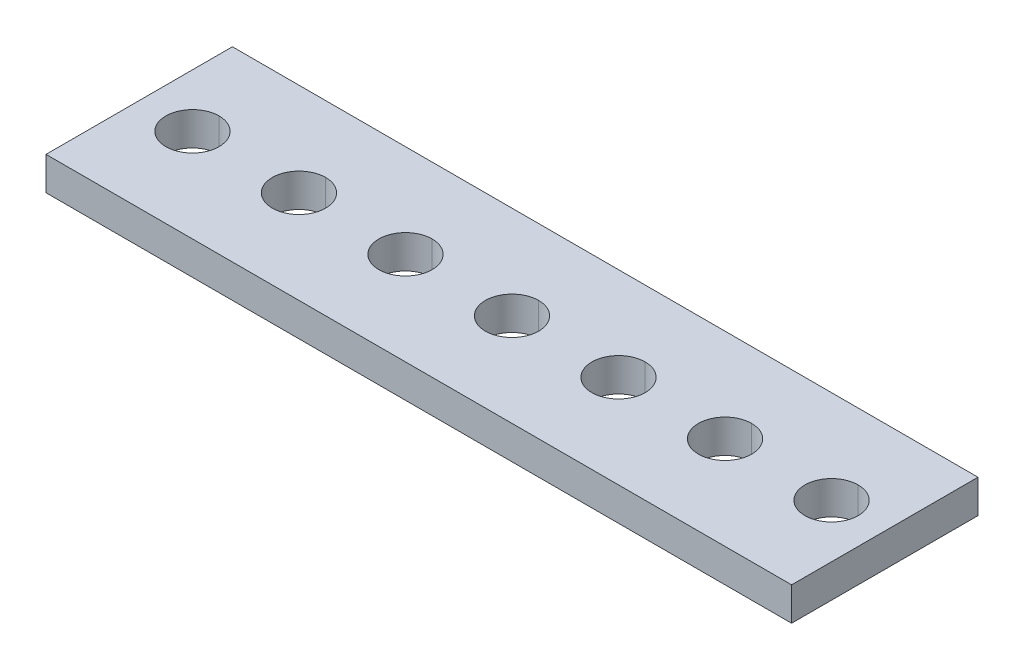
ISO-10303-21;
HEADER;
FILE_DESCRIPTION(('STEP AP214'),'2;1');
FILE_NAME('part.step','',(''),(''),'','','');
FILE_SCHEMA(('AUTOMOTIVE_DESIGN { 1 0 10303 214 1 1 1 1 }'));
ENDSEC;
DATA;
#1=APPLICATION_CONTEXT('core data for automotive mechanical design processes');
#2=APPLICATION_PROTOCOL_DEFINITION('international standard','automotive_design',2000,#1);
#3=PRODUCT_CONTEXT('',#1,'mechanical');
#4=PRODUCT('Part','Part','',(#3));
#5=PRODUCT_RELATED_PRODUCT_CATEGORY('part','',(#4));
#6=PRODUCT_DEFINITION_FORMATION('','',#4);
#7=PRODUCT_DEFINITION_CONTEXT('part definition',#1,'design');
#8=PRODUCT_DEFINITION('design','',#6,#7);
#9=PRODUCT_DEFINITION_SHAPE('','',#8);
#10=(LENGTH_UNIT() NAMED_UNIT(*) SI_UNIT(.MILLI.,.METRE.));
#11=(NAMED_UNIT(*) PLANE_ANGLE_UNIT() SI_UNIT($,.RADIAN.));
#12=(NAMED_UNIT(*) SI_UNIT($,.STERADIAN.) SOLID_ANGLE_UNIT());
#13=UNCERTAINTY_MEASURE_WITH_UNIT(LENGTH_MEASURE(1.E-05),#10,'distance_accuracy_value','');
#14=(GEOMETRIC_REPRESENTATION_CONTEXT(3) GLOBAL_UNCERTAINTY_ASSIGNED_CONTEXT((#13)) GLOBAL_UNIT_ASSIGNED_CONTEXT((#10,
#11,#12)) REPRESENTATION_CONTEXT('',''));
#15=CARTESIAN_POINT('',(0.,0.,0.));
#16=DIRECTION('',(0.,0.,1.));
#17=DIRECTION('',(1.,0.,0.));
#18=AXIS2_PLACEMENT_3D('',#15,#16,#17);
#19=CARTESIAN_POINT('',(-8.,0.,0.));
#20=DIRECTION('',(0.,1.,0.));
#21=DIRECTION('',(0.,0.,1.));
#22=AXIS2_PLACEMENT_3D('',#19,#20,#21);
#23=CYLINDRICAL_SURFACE('',#22,2.);
#24=CARTESIAN_POINT('',(-8.,0.,0.));
#25=DIRECTION('',(0.,-1.,0.));
#26=DIRECTION('',(0.,0.,1.));
#27=AXIS2_PLACEMENT_3D('',#24,#25,#26);
#28=CIRCLE('',#27,2.);
#29=CARTESIAN_POINT('',(-8.,0.,2.));
#30=VERTEX_POINT('',#29);
#31=CARTESIAN_POINT('',(-8.,0.,-2.));
#32=VERTEX_POINT('',#31);
#33=EDGE_CURVE('E10',#30,#32,#28,.T.);
#34=ORIENTED_EDGE('',*,*,#33,.T.);
#35=DIRECTION('',(0.,1.,0.));
#36=VECTOR('',#35,1.);
#37=CARTESIAN_POINT('',(-8.,0.,-2.));
#38=LINE('',#37,#36);
#39=CARTESIAN_POINT('',(-8.,2.5,-2.));
#40=VERTEX_POINT('',#39);
#41=EDGE_CURVE('E27',#32,#40,#38,.T.);
#42=ORIENTED_EDGE('',*,*,#41,.T.);
#43=CARTESIAN_POINT('',(-8.,2.5,0.));
#44=DIRECTION('',(0.,-1.,0.));
#45=DIRECTION('',(0.,0.,1.));
#46=AXIS2_PLACEMENT_3D('',#43,#44,#45);
#47=CIRCLE('',#46,2.);
#48=CARTESIAN_POINT('',(-8.,2.5,2.));
#49=VERTEX_POINT('',#48);
#50=EDGE_CURVE('E328',#49,#40,#47,.T.);
#51=ORIENTED_EDGE('',*,*,#50,.F.);
#52=DIRECTION('',(0.,1.,0.));
#53=VECTOR('',#52,1.);
#54=CARTESIAN_POINT('',(-8.,0.,2.));
#55=LINE('',#54,#53);
#56=EDGE_CURVE('E370',#30,#49,#55,.T.);
#57=ORIENTED_EDGE('',*,*,#56,.F.);
#58=EDGE_LOOP('',(#34,#42,#51,#57));
#59=FACE_BOUND('',#58,.T.);
#60=ADVANCED_FACE('F16',(#59),#23,.F.);
#61=CARTESIAN_POINT('',(-16.,0.,0.));
#62=DIRECTION('',(0.,1.,0.));
#63=DIRECTION('',(0.,0.,1.));
#64=AXIS2_PLACEMENT_3D('',#61,#62,#63);
#65=CYLINDRICAL_SURFACE('',#64,2.);
#66=CARTESIAN_POINT('',(-16.,0.,0.));
#67=DIRECTION('',(0.,-1.,0.));
#68=DIRECTION('',(0.,0.,1.));
#69=AXIS2_PLACEMENT_3D('',#66,#67,#68);
#70=CIRCLE('',#69,2.);
#71=CARTESIAN_POINT('',(-16.,0.,2.));
#72=VERTEX_POINT('',#71);
#73=CARTESIAN_POINT('',(-16.,0.,-2.));
#74=VERTEX_POINT('',#73);
#75=EDGE_CURVE('E238',#72,#74,#70,.T.);
#76=ORIENTED_EDGE('',*,*,#75,.T.);
#77=DIRECTION('',(0.,1.,0.));
#78=VECTOR('',#77,1.);
#79=CARTESIAN_POINT('',(-16.,0.,-2.));
#80=LINE('',#79,#78);
#81=CARTESIAN_POINT('',(-16.,2.5,-2.));
#82=VERTEX_POINT('',#81);
#83=EDGE_CURVE('E242',#74,#82,#80,.T.);
#84=ORIENTED_EDGE('',*,*,#83,.T.);
#85=CARTESIAN_POINT('',(-16.,2.5,0.));
#86=DIRECTION('',(0.,-1.,0.));
#87=DIRECTION('',(0.,0.,1.));
#88=AXIS2_PLACEMENT_3D('',#85,#86,#87);
#89=CIRCLE('',#88,2.);
#90=CARTESIAN_POINT('',(-16.,2.5,2.));
#91=VERTEX_POINT('',#90);
#92=EDGE_CURVE('E333',#91,#82,#89,.T.);
#93=ORIENTED_EDGE('',*,*,#92,.F.);
#94=DIRECTION('',(0.,1.,0.));
#95=VECTOR('',#94,1.);
#96=CARTESIAN_POINT('',(-16.,0.,2.));
#97=LINE('',#96,#95);
#98=EDGE_CURVE('E317',#72,#91,#97,.T.);
#99=ORIENTED_EDGE('',*,*,#98,.F.);
#100=EDGE_LOOP('',(#76,#84,#93,#99));
#101=FACE_BOUND('',#100,.T.);
#102=ADVANCED_FACE('F18',(#101),#65,.F.);
#103=CARTESIAN_POINT('',(-24.,0.,0.));
#104=DIRECTION('',(0.,1.,0.));
#105=DIRECTION('',(0.,0.,1.));
#106=AXIS2_PLACEMENT_3D('',#103,#104,#105);
#107=CYLINDRICAL_SURFACE('',#106,2.);
#108=CARTESIAN_POINT('',(-24.,0.,0.));
#109=DIRECTION('',(0.,-1.,0.));
#110=DIRECTION('',(0.,0.,1.));
#111=AXIS2_PLACEMENT_3D('',#108,#109,#110);
#112=CIRCLE('',#111,2.);
#113=CARTESIAN_POINT('',(-24.,0.,2.));
#114=VERTEX_POINT('',#113);
#115=CARTESIAN_POINT('',(-24.,0.,-2.));
#116=VERTEX_POINT('',#115);
#117=EDGE_CURVE('E298',#114,#116,#112,.T.);
#118=ORIENTED_EDGE('',*,*,#117,.T.);
#119=DIRECTION('',(0.,1.,0.));
#120=VECTOR('',#119,1.);
#121=CARTESIAN_POINT('',(-24.,0.,-2.));
#122=LINE('',#121,#120);
#123=CARTESIAN_POINT('',(-24.,2.5,-2.));
#124=VERTEX_POINT('',#123);
#125=EDGE_CURVE('E91',#116,#124,#122,.T.);
#126=ORIENTED_EDGE('',*,*,#125,.T.);
#127=CARTESIAN_POINT('',(-24.,2.5,0.));
#128=DIRECTION('',(0.,-1.,0.));
#129=DIRECTION('',(0.,0.,1.));
#130=AXIS2_PLACEMENT_3D('',#127,#128,#129);
#131=CIRCLE('',#130,2.);
#132=CARTESIAN_POINT('',(-24.,2.5,2.));
#133=VERTEX_POINT('',#132);
#134=EDGE_CURVE('E80',#133,#124,#131,.T.);
#135=ORIENTED_EDGE('',*,*,#134,.F.);
#136=DIRECTION('',(0.,1.,0.));
#137=VECTOR('',#136,1.);
#138=CARTESIAN_POINT('',(-24.,0.,2.));
#139=LINE('',#138,#137);
#140=EDGE_CURVE('E247',#114,#133,#139,.T.);
#141=ORIENTED_EDGE('',*,*,#140,.F.);
#142=EDGE_LOOP('',(#118,#126,#135,#141));
#143=FACE_BOUND('',#142,.T.);
#144=ADVANCED_FACE('F448',(#143),#107,.F.);
#145=CARTESIAN_POINT('',(24.,0.,0.));
#146=DIRECTION('',(0.,1.,0.));
#147=DIRECTION('',(0.,0.,1.));
#148=AXIS2_PLACEMENT_3D('',#145,#146,#147);
#149=CYLINDRICAL_SURFACE('',#148,2.);
#150=CARTESIAN_POINT('',(24.,0.,0.));
#151=DIRECTION('',(0.,1.,0.));
#152=DIRECTION('',(0.,0.,1.));
#153=AXIS2_PLACEMENT_3D('',#150,#151,#152);
#154=CIRCLE('',#153,2.);
#155=CARTESIAN_POINT('',(24.,0.,-2.));
#156=VERTEX_POINT('',#155);
#157=CARTESIAN_POINT('',(24.,0.,2.));
#158=VERTEX_POINT('',#157);
#159=EDGE_CURVE('E197',#156,#158,#154,.T.);
#160=ORIENTED_EDGE('',*,*,#159,.F.);
#161=DIRECTION('',(0.,1.,0.));
#162=VECTOR('',#161,1.);
#163=CARTESIAN_POINT('',(24.,0.,-2.));
#164=LINE('',#163,#162);
#165=CARTESIAN_POINT('',(24.,2.5,-2.));
#166=VERTEX_POINT('',#165);
#167=EDGE_CURVE('E216',#156,#166,#164,.T.);
#168=ORIENTED_EDGE('',*,*,#167,.T.);
#169=CARTESIAN_POINT('',(24.,2.5,0.));
#170=DIRECTION('',(0.,1.,0.));
#171=DIRECTION('',(0.,0.,1.));
#172=AXIS2_PLACEMENT_3D('',#169,#170,#171);
#173=CIRCLE('',#172,2.);
#174=CARTESIAN_POINT('',(24.,2.5,2.));
#175=VERTEX_POINT('',#174);
#176=EDGE_CURVE('E199',#166,#175,#173,.T.);
#177=ORIENTED_EDGE('',*,*,#176,.T.);
#178=DIRECTION('',(0.,1.,0.));
#179=VECTOR('',#178,1.);
#180=CARTESIAN_POINT('',(24.,0.,2.));
#181=LINE('',#180,#179);
#182=EDGE_CURVE('E193',#158,#175,#181,.T.);
#183=ORIENTED_EDGE('',*,*,#182,.F.);
#184=EDGE_LOOP('',(#160,#168,#177,#183));
#185=FACE_BOUND('',#184,.T.);
#186=ADVANCED_FACE('F195',(#185),#149,.F.);
#187=CARTESIAN_POINT('',(16.,0.,0.));
#188=DIRECTION('',(0.,1.,0.));
#189=DIRECTION('',(0.,0.,1.));
#190=AXIS2_PLACEMENT_3D('',#187,#188,#189);
#191=CYLINDRICAL_SURFACE('',#190,2.);
#192=CARTESIAN_POINT('',(16.,0.,0.));
#193=DIRECTION('',(0.,1.,0.));
#194=DIRECTION('',(0.,0.,1.));
#195=AXIS2_PLACEMENT_3D('',#192,#193,#194);
#196=CIRCLE('',#195,2.);
#197=CARTESIAN_POINT('',(16.,0.,-2.));
#198=VERTEX_POINT('',#197);
#199=CARTESIAN_POINT('',(16.,0.,2.));
#200=VERTEX_POINT('',#199);
#201=EDGE_CURVE('E218',#198,#200,#196,.T.);
#202=ORIENTED_EDGE('',*,*,#201,.F.);
#203=DIRECTION('',(0.,1.,0.));
#204=VECTOR('',#203,1.);
#205=CARTESIAN_POINT('',(16.,0.,-2.));
#206=LINE('',#205,#204);
#207=CARTESIAN_POINT('',(16.,2.5,-2.));
#208=VERTEX_POINT('',#207);
#209=EDGE_CURVE('E280',#198,#208,#206,.T.);
#210=ORIENTED_EDGE('',*,*,#209,.T.);
#211=CARTESIAN_POINT('',(16.,2.5,0.));
#212=DIRECTION('',(0.,1.,0.));
#213=DIRECTION('',(0.,0.,1.));
#214=AXIS2_PLACEMENT_3D('',#211,#212,#213);
#215=CIRCLE('',#214,2.);
#216=CARTESIAN_POINT('',(16.,2.5,2.));
#217=VERTEX_POINT('',#216);
#218=EDGE_CURVE('E293',#208,#217,#215,.T.);
#219=ORIENTED_EDGE('',*,*,#218,.T.);
#220=DIRECTION('',(0.,1.,0.));
#221=VECTOR('',#220,1.);
#222=CARTESIAN_POINT('',(16.,0.,2.));
#223=LINE('',#222,#221);
#224=EDGE_CURVE('E287',#200,#217,#223,.T.);
#225=ORIENTED_EDGE('',*,*,#224,.F.);
#226=EDGE_LOOP('',(#202,#210,#219,#225));
#227=FACE_BOUND('',#226,.T.);
#228=ADVANCED_FACE('F418',(#227),#191,.F.);
#229=CARTESIAN_POINT('',(8.,0.,0.));
#230=DIRECTION('',(0.,1.,0.));
#231=DIRECTION('',(0.,0.,1.));
#232=AXIS2_PLACEMENT_3D('',#229,#230,#231);
#233=CYLINDRICAL_SURFACE('',#232,2.);
#234=CARTESIAN_POINT('',(8.,0.,0.));
#235=DIRECTION('',(0.,1.,0.));
#236=DIRECTION('',(0.,0.,1.));
#237=AXIS2_PLACEMENT_3D('',#234,#235,#236);
#238=CIRCLE('',#237,2.);
#239=CARTESIAN_POINT('',(8.,0.,-2.));
#240=VERTEX_POINT('',#239);
#241=CARTESIAN_POINT('',(8.,0.,2.));
#242=VERTEX_POINT('',#241);
#243=EDGE_CURVE('E265',#240,#242,#238,.T.);
#244=ORIENTED_EDGE('',*,*,#243,.F.);
#245=DIRECTION('',(0.,1.,0.));
#246=VECTOR('',#245,1.);
#247=CARTESIAN_POINT('',(8.,0.,-2.));
#248=LINE('',#247,#246);
#249=CARTESIAN_POINT('',(8.,2.5,-2.));
#250=VERTEX_POINT('',#249);
#251=EDGE_CURVE('E289',#240,#250,#248,.T.);
#252=ORIENTED_EDGE('',*,*,#251,.T.);
#253=CARTESIAN_POINT('',(8.,2.5,0.));
#254=DIRECTION('',(0.,1.,0.));
#255=DIRECTION('',(0.,0.,1.));
#256=AXIS2_PLACEMENT_3D('',#253,#254,#255);
#257=CIRCLE('',#256,2.);
#258=CARTESIAN_POINT('',(8.,2.5,2.));
#259=VERTEX_POINT('',#258);
#260=EDGE_CURVE('E294',#250,#259,#257,.T.);
#261=ORIENTED_EDGE('',*,*,#260,.T.);
#262=DIRECTION('',(0.,1.,0.));
#263=VECTOR('',#262,1.);
#264=CARTESIAN_POINT('',(8.,0.,2.));
#265=LINE('',#264,#263);
#266=EDGE_CURVE('E277',#242,#259,#265,.T.);
#267=ORIENTED_EDGE('',*,*,#266,.F.);
#268=EDGE_LOOP('',(#244,#252,#261,#267));
#269=FACE_BOUND('',#268,.T.);
#270=ADVANCED_FACE('F352',(#269),#233,.F.);
#271=CARTESIAN_POINT('',(0.,0.,0.));
#272=DIRECTION('',(0.,1.,0.));
#273=DIRECTION('',(0.,0.,1.));
#274=AXIS2_PLACEMENT_3D('',#271,#272,#273);
#275=CYLINDRICAL_SURFACE('',#274,2.);
#276=CARTESIAN_POINT('',(0.,0.,0.));
#277=DIRECTION('',(0.,1.,0.));
#278=DIRECTION('',(0.,0.,1.));
#279=AXIS2_PLACEMENT_3D('',#276,#277,#278);
#280=CIRCLE('',#279,2.);
#281=CARTESIAN_POINT('',(0.,0.,-2.));
#282=VERTEX_POINT('',#281);
#283=CARTESIAN_POINT('',(0.,0.,2.));
#284=VERTEX_POINT('',#283);
#285=EDGE_CURVE('E266',#282,#284,#280,.T.);
#286=ORIENTED_EDGE('',*,*,#285,.F.);
#287=DIRECTION('',(0.,1.,0.));
#288=VECTOR('',#287,1.);
#289=CARTESIAN_POINT('',(0.,0.,-2.));
#290=LINE('',#289,#288);
#291=CARTESIAN_POINT('',(0.,2.5,-2.));
#292=VERTEX_POINT('',#291);
#293=EDGE_CURVE('E260',#282,#292,#290,.T.);
#294=ORIENTED_EDGE('',*,*,#293,.T.);
#295=CARTESIAN_POINT('',(0.,2.5,0.));
#296=DIRECTION('',(0.,1.,0.));
#297=DIRECTION('',(0.,0.,1.));
#298=AXIS2_PLACEMENT_3D('',#295,#296,#297);
#299=CIRCLE('',#298,2.);
#300=CARTESIAN_POINT('',(0.,2.5,2.));
#301=VERTEX_POINT('',#300);
#302=EDGE_CURVE('E256',#292,#301,#299,.T.);
#303=ORIENTED_EDGE('',*,*,#302,.T.);
#304=DIRECTION('',(0.,1.,0.));
#305=VECTOR('',#304,1.);
#306=CARTESIAN_POINT('',(0.,0.,2.));
#307=LINE('',#306,#305);
#308=EDGE_CURVE('E213',#284,#301,#307,.T.);
#309=ORIENTED_EDGE('',*,*,#308,.F.);
#310=EDGE_LOOP('',(#286,#294,#303,#309));
#311=FACE_BOUND('',#310,.T.);
#312=ADVANCED_FACE('F471',(#311),#275,.F.);
#313=CARTESIAN_POINT('',(-28.,2.5,-7.));
#314=DIRECTION('',(1.,0.,0.));
#315=DIRECTION('',(0.,1.,0.));
#316=AXIS2_PLACEMENT_3D('',#313,#314,#315);
#317=PLANE('',#316);
#318=DIRECTION('',(0.,0.,1.));
#319=VECTOR('',#318,1.);
#320=CARTESIAN_POINT('',(-28.,0.,-7.));
#321=LINE('',#320,#319);
#322=CARTESIAN_POINT('',(-28.,0.,-7.));
#323=VERTEX_POINT('',#322);
#324=CARTESIAN_POINT('',(-28.,0.,7.));
#325=VERTEX_POINT('',#324);
#326=EDGE_CURVE('E261',#323,#325,#321,.T.);
#327=ORIENTED_EDGE('',*,*,#326,.T.);
#328=DIRECTION('',(0.,-1.,0.));
#329=VECTOR('',#328,1.);
#330=CARTESIAN_POINT('',(-28.,2.5,7.));
#331=LINE('',#330,#329);
#332=CARTESIAN_POINT('',(-28.,2.5,7.));
#333=VERTEX_POINT('',#332);
#334=EDGE_CURVE('E281',#333,#325,#331,.T.);
#335=ORIENTED_EDGE('',*,*,#334,.F.);
#336=DIRECTION('',(0.,0.,1.));
#337=VECTOR('',#336,1.);
#338=CARTESIAN_POINT('',(-28.,2.5,-7.));
#339=LINE('',#338,#337);
#340=CARTESIAN_POINT('',(-28.,2.5,-7.));
#341=VERTEX_POINT('',#340);
#342=EDGE_CURVE('E230',#341,#333,#339,.T.);
#343=ORIENTED_EDGE('',*,*,#342,.F.);
#344=DIRECTION('',(0.,-1.,0.));
#345=VECTOR('',#344,1.);
#346=CARTESIAN_POINT('',(-28.,2.5,-7.));
#347=LINE('',#346,#345);
#348=EDGE_CURVE('E344',#341,#323,#347,.T.);
#349=ORIENTED_EDGE('',*,*,#348,.T.);
#350=EDGE_LOOP('',(#327,#335,#343,#349));
#351=FACE_BOUND('',#350,.T.);
#352=ADVANCED_FACE('F459',(#351),#317,.F.);
#353=CARTESIAN_POINT('',(28.,2.5,7.));
#354=DIRECTION('',(0.,0.,-1.));
#355=DIRECTION('',(-1.,0.,0.));
#356=AXIS2_PLACEMENT_3D('',#353,#354,#355);
#357=PLANE('',#356);
#358=DIRECTION('',(1.,0.,0.));
#359=VECTOR('',#358,1.);
#360=CARTESIAN_POINT('',(28.,0.,7.));
#361=LINE('',#360,#359);
#362=CARTESIAN_POINT('',(28.,0.,7.));
#363=VERTEX_POINT('',#362);
#364=EDGE_CURVE('E284',#325,#363,#361,.T.);
#365=ORIENTED_EDGE('',*,*,#364,.T.);
#366=DIRECTION('',(0.,-1.,0.));
#367=VECTOR('',#366,1.);
#368=CARTESIAN_POINT('',(28.,2.5,7.));
#369=LINE('',#368,#367);
#370=CARTESIAN_POINT('',(28.,2.5,7.));
#371=VERTEX_POINT('',#370);
#372=EDGE_CURVE('E232',#371,#363,#369,.T.);
#373=ORIENTED_EDGE('',*,*,#372,.F.);
#374=DIRECTION('',(1.,0.,0.));
#375=VECTOR('',#374,1.);
#376=CARTESIAN_POINT('',(28.,2.5,7.));
#377=LINE('',#376,#375);
#378=EDGE_CURVE('E20',#333,#371,#377,.T.);
#379=ORIENTED_EDGE('',*,*,#378,.F.);
#380=ORIENTED_EDGE('',*,*,#334,.T.);
#381=EDGE_LOOP('',(#365,#373,#379,#380));
#382=FACE_BOUND('',#381,.T.);
#383=ADVANCED_FACE('F456',(#382),#357,.F.);
#384=CARTESIAN_POINT('',(28.,2.5,-7.));
#385=DIRECTION('',(-1.,0.,0.));
#386=DIRECTION('',(0.,0.,1.));
#387=AXIS2_PLACEMENT_3D('',#384,#385,#386);
#388=PLANE('',#387);
#389=DIRECTION('',(0.,0.,-1.));
#390=VECTOR('',#389,1.);
#391=CARTESIAN_POINT('',(28.,0.,-7.));
#392=LINE('',#391,#390);
#393=CARTESIAN_POINT('',(28.,0.,-7.));
#394=VERTEX_POINT('',#393);
#395=EDGE_CURVE('E234',#363,#394,#392,.T.);
#396=ORIENTED_EDGE('',*,*,#395,.T.);
#397=DIRECTION('',(0.,-1.,0.));
#398=VECTOR('',#397,1.);
#399=CARTESIAN_POINT('',(28.,2.5,-7.));
#400=LINE('',#399,#398);
#401=CARTESIAN_POINT('',(28.,2.5,-7.));
#402=VERTEX_POINT('',#401);
#403=EDGE_CURVE('E255',#402,#394,#400,.T.);
#404=ORIENTED_EDGE('',*,*,#403,.F.);
#405=DIRECTION('',(0.,0.,-1.));
#406=VECTOR('',#405,1.);
#407=CARTESIAN_POINT('',(28.,2.5,-7.));
#408=LINE('',#407,#406);
#409=EDGE_CURVE('E327',#371,#402,#408,.T.);
#410=ORIENTED_EDGE('',*,*,#409,.F.);
#411=ORIENTED_EDGE('',*,*,#372,.T.);
#412=EDGE_LOOP('',(#396,#404,#410,#411));
#413=FACE_BOUND('',#412,.T.);
#414=ADVANCED_FACE('F437',(#413),#388,.F.);
#415=CARTESIAN_POINT('',(28.,2.5,-7.));
#416=DIRECTION('',(0.,0.,1.));
#417=DIRECTION('',(1.,0.,0.));
#418=AXIS2_PLACEMENT_3D('',#415,#416,#417);
#419=PLANE('',#418);
#420=DIRECTION('',(-1.,0.,0.));
#421=VECTOR('',#420,1.);
#422=CARTESIAN_POINT('',(28.,0.,-7.));
#423=LINE('',#422,#421);
#424=EDGE_CURVE('E235',#394,#323,#423,.T.);
#425=ORIENTED_EDGE('',*,*,#424,.T.);
#426=ORIENTED_EDGE('',*,*,#348,.F.);
#427=DIRECTION('',(-1.,0.,0.));
#428=VECTOR('',#427,1.);
#429=CARTESIAN_POINT('',(28.,2.5,-7.));
#430=LINE('',#429,#428);
#431=EDGE_CURVE('E323',#402,#341,#430,.T.);
#432=ORIENTED_EDGE('',*,*,#431,.F.);
#433=ORIENTED_EDGE('',*,*,#403,.T.);
#434=EDGE_LOOP('',(#425,#426,#432,#433));
#435=FACE_BOUND('',#434,.T.);
#436=ADVANCED_FACE('F426',(#435),#419,.F.);
#437=CARTESIAN_POINT('',(0.,2.5,0.));
#438=DIRECTION('',(0.,-1.,0.));
#439=DIRECTION('',(0.,0.,-1.));
#440=AXIS2_PLACEMENT_3D('',#437,#438,#439);
#441=PLANE('',#440);
#442=ORIENTED_EDGE('',*,*,#342,.T.);
#443=ORIENTED_EDGE('',*,*,#378,.T.);
#444=ORIENTED_EDGE('',*,*,#409,.T.);
#445=ORIENTED_EDGE('',*,*,#431,.T.);
#446=EDGE_LOOP('',(#442,#443,#444,#445));
#447=FACE_BOUND('',#446,.T.);
#448=ORIENTED_EDGE('',*,*,#50,.T.);
#449=CARTESIAN_POINT('',(-8.,2.5,0.));
#450=DIRECTION('',(0.,-1.,0.));
#451=DIRECTION('',(0.,0.,1.));
#452=AXIS2_PLACEMENT_3D('',#449,#450,#451);
#453=CIRCLE('',#452,2.);
#454=EDGE_CURVE('E329',#40,#49,#453,.T.);
#455=ORIENTED_EDGE('',*,*,#454,.T.);
#456=EDGE_LOOP('',(#448,#455));
#457=FACE_BOUND('',#456,.T.);
#458=ORIENTED_EDGE('',*,*,#92,.T.);
#459=CARTESIAN_POINT('',(-16.,2.5,0.));
#460=DIRECTION('',(0.,-1.,0.));
#461=DIRECTION('',(0.,0.,1.));
#462=AXIS2_PLACEMENT_3D('',#459,#460,#461);
#463=CIRCLE('',#462,2.);
#464=EDGE_CURVE('E377',#82,#91,#463,.T.);
#465=ORIENTED_EDGE('',*,*,#464,.T.);
#466=EDGE_LOOP('',(#458,#465));
#467=FACE_BOUND('',#466,.T.);
#468=ORIENTED_EDGE('',*,*,#134,.T.);
#469=CARTESIAN_POINT('',(-24.,2.5,0.));
#470=DIRECTION('',(0.,-1.,0.));
#471=DIRECTION('',(0.,0.,1.));
#472=AXIS2_PLACEMENT_3D('',#469,#470,#471);
#473=CIRCLE('',#472,2.);
#474=EDGE_CURVE('E243',#124,#133,#473,.T.);
#475=ORIENTED_EDGE('',*,*,#474,.T.);
#476=EDGE_LOOP('',(#468,#475));
#477=FACE_BOUND('',#476,.T.);
#478=CARTESIAN_POINT('',(8.,2.5,0.));
#479=DIRECTION('',(0.,1.,0.));
#480=DIRECTION('',(0.,0.,1.));
#481=AXIS2_PLACEMENT_3D('',#478,#479,#480);
#482=CIRCLE('',#481,2.);
#483=EDGE_CURVE('E302',#259,#250,#482,.T.);
#484=ORIENTED_EDGE('',*,*,#483,.F.);
#485=ORIENTED_EDGE('',*,*,#260,.F.);
#486=EDGE_LOOP('',(#484,#485));
#487=FACE_BOUND('',#486,.T.);
#488=CARTESIAN_POINT('',(0.,2.5,0.));
#489=DIRECTION('',(0.,1.,0.));
#490=DIRECTION('',(0.,0.,1.));
#491=AXIS2_PLACEMENT_3D('',#488,#489,#490);
#492=CIRCLE('',#491,2.);
#493=EDGE_CURVE('E273',#301,#292,#492,.T.);
#494=ORIENTED_EDGE('',*,*,#493,.F.);
#495=ORIENTED_EDGE('',*,*,#302,.F.);
#496=EDGE_LOOP('',(#494,#495));
#497=FACE_BOUND('',#496,.T.);
#498=CARTESIAN_POINT('',(16.,2.5,0.));
#499=DIRECTION('',(0.,1.,0.));
#500=DIRECTION('',(0.,0.,1.));
#501=AXIS2_PLACEMENT_3D('',#498,#499,#500);
#502=CIRCLE('',#501,2.);
#503=EDGE_CURVE('E205',#217,#208,#502,.T.);
#504=ORIENTED_EDGE('',*,*,#503,.F.);
#505=ORIENTED_EDGE('',*,*,#218,.F.);
#506=EDGE_LOOP('',(#504,#505));
#507=FACE_BOUND('',#506,.T.);
#508=CARTESIAN_POINT('',(24.,2.5,0.));
#509=DIRECTION('',(0.,1.,0.));
#510=DIRECTION('',(0.,0.,1.));
#511=AXIS2_PLACEMENT_3D('',#508,#509,#510);
#512=CIRCLE('',#511,2.);
#513=EDGE_CURVE('E206',#175,#166,#512,.T.);
#514=ORIENTED_EDGE('',*,*,#513,.F.);
#515=ORIENTED_EDGE('',*,*,#176,.F.);
#516=EDGE_LOOP('',(#514,#515));
#517=FACE_BOUND('',#516,.T.);
#518=ADVANCED_FACE('F356',(#447,#457,#467,#477,#487,#497,#507,#517),#441,.F.);
#519=CARTESIAN_POINT('',(0.,0.,0.));
#520=DIRECTION('',(0.,-1.,0.));
#521=DIRECTION('',(0.,0.,-1.));
#522=AXIS2_PLACEMENT_3D('',#519,#520,#521);
#523=PLANE('',#522);
#524=ORIENTED_EDGE('',*,*,#326,.F.);
#525=ORIENTED_EDGE('',*,*,#424,.F.);
#526=ORIENTED_EDGE('',*,*,#395,.F.);
#527=ORIENTED_EDGE('',*,*,#364,.F.);
#528=EDGE_LOOP('',(#524,#525,#526,#527));
#529=FACE_BOUND('',#528,.T.);
#530=ORIENTED_EDGE('',*,*,#33,.F.);
#531=CARTESIAN_POINT('',(-8.,0.,0.));
#532=DIRECTION('',(0.,-1.,0.));
#533=DIRECTION('',(0.,0.,1.));
#534=AXIS2_PLACEMENT_3D('',#531,#532,#533);
#535=CIRCLE('',#534,2.);
#536=EDGE_CURVE('E374',#32,#30,#535,.T.);
#537=ORIENTED_EDGE('',*,*,#536,.F.);
#538=EDGE_LOOP('',(#530,#537));
#539=FACE_BOUND('',#538,.T.);
#540=ORIENTED_EDGE('',*,*,#75,.F.);
#541=CARTESIAN_POINT('',(-16.,0.,0.));
#542=DIRECTION('',(0.,-1.,0.));
#543=DIRECTION('',(0.,0.,1.));
#544=AXIS2_PLACEMENT_3D('',#541,#542,#543);
#545=CIRCLE('',#544,2.);
#546=EDGE_CURVE('E251',#74,#72,#545,.T.);
#547=ORIENTED_EDGE('',*,*,#546,.F.);
#548=EDGE_LOOP('',(#540,#547));
#549=FACE_BOUND('',#548,.T.);
#550=ORIENTED_EDGE('',*,*,#117,.F.);
#551=CARTESIAN_POINT('',(-24.,0.,0.));
#552=DIRECTION('',(0.,-1.,0.));
#553=DIRECTION('',(0.,0.,1.));
#554=AXIS2_PLACEMENT_3D('',#551,#552,#553);
#555=CIRCLE('',#554,2.);
#556=EDGE_CURVE('E250',#116,#114,#555,.T.);
#557=ORIENTED_EDGE('',*,*,#556,.F.);
#558=EDGE_LOOP('',(#550,#557));
#559=FACE_BOUND('',#558,.T.);
#560=CARTESIAN_POINT('',(8.,0.,0.));
#561=DIRECTION('',(0.,1.,0.));
#562=DIRECTION('',(0.,0.,1.));
#563=AXIS2_PLACEMENT_3D('',#560,#561,#562);
#564=CIRCLE('',#563,2.);
#565=EDGE_CURVE('E246',#242,#240,#564,.T.);
#566=ORIENTED_EDGE('',*,*,#565,.T.);
#567=ORIENTED_EDGE('',*,*,#243,.T.);
#568=EDGE_LOOP('',(#566,#567));
#569=FACE_BOUND('',#568,.T.);
#570=CARTESIAN_POINT('',(0.,0.,0.));
#571=DIRECTION('',(0.,1.,0.));
#572=DIRECTION('',(0.,0.,1.));
#573=AXIS2_PLACEMENT_3D('',#570,#571,#572);
#574=CIRCLE('',#573,2.);
#575=EDGE_CURVE('E262',#284,#282,#574,.T.);
#576=ORIENTED_EDGE('',*,*,#575,.T.);
#577=ORIENTED_EDGE('',*,*,#285,.T.);
#578=EDGE_LOOP('',(#576,#577));
#579=FACE_BOUND('',#578,.T.);
#580=CARTESIAN_POINT('',(16.,0.,0.));
#581=DIRECTION('',(0.,1.,0.));
#582=DIRECTION('',(0.,0.,1.));
#583=AXIS2_PLACEMENT_3D('',#580,#581,#582);
#584=CIRCLE('',#583,2.);
#585=EDGE_CURVE('E226',#200,#198,#584,.T.);
#586=ORIENTED_EDGE('',*,*,#585,.T.);
#587=ORIENTED_EDGE('',*,*,#201,.T.);
#588=EDGE_LOOP('',(#586,#587));
#589=FACE_BOUND('',#588,.T.);
#590=CARTESIAN_POINT('',(24.,0.,0.));
#591=DIRECTION('',(0.,1.,0.));
#592=DIRECTION('',(0.,0.,1.));
#593=AXIS2_PLACEMENT_3D('',#590,#591,#592);
#594=CIRCLE('',#593,2.);
#595=EDGE_CURVE('E211',#158,#156,#594,.T.);
#596=ORIENTED_EDGE('',*,*,#595,.T.);
#597=ORIENTED_EDGE('',*,*,#159,.T.);
#598=EDGE_LOOP('',(#596,#597));
#599=FACE_BOUND('',#598,.T.);
#600=ADVANCED_FACE('F210',(#529,#539,#549,#559,#569,#579,#589,#599),#523,.T.);
#601=CARTESIAN_POINT('',(0.,0.,0.));
#602=DIRECTION('',(0.,1.,0.));
#603=DIRECTION('',(0.,0.,1.));
#604=AXIS2_PLACEMENT_3D('',#601,#602,#603);
#605=CYLINDRICAL_SURFACE('',#604,2.);
#606=ORIENTED_EDGE('',*,*,#293,.F.);
#607=ORIENTED_EDGE('',*,*,#575,.F.);
#608=ORIENTED_EDGE('',*,*,#308,.T.);
#609=ORIENTED_EDGE('',*,*,#493,.T.);
#610=EDGE_LOOP('',(#606,#607,#608,#609));
#611=FACE_BOUND('',#610,.T.);
#612=ADVANCED_FACE('F434',(#611),#605,.F.);
#613=CARTESIAN_POINT('',(8.,0.,0.));
#614=DIRECTION('',(0.,1.,0.));
#615=DIRECTION('',(0.,0.,1.));
#616=AXIS2_PLACEMENT_3D('',#613,#614,#615);
#617=CYLINDRICAL_SURFACE('',#616,2.);
#618=ORIENTED_EDGE('',*,*,#251,.F.);
#619=ORIENTED_EDGE('',*,*,#565,.F.);
#620=ORIENTED_EDGE('',*,*,#266,.T.);
#621=ORIENTED_EDGE('',*,*,#483,.T.);
#622=EDGE_LOOP('',(#618,#619,#620,#621));
#623=FACE_BOUND('',#622,.T.);
#624=ADVANCED_FACE('F468',(#623),#617,.F.);
#625=CARTESIAN_POINT('',(16.,0.,0.));
#626=DIRECTION('',(0.,1.,0.));
#627=DIRECTION('',(0.,0.,1.));
#628=AXIS2_PLACEMENT_3D('',#625,#626,#627);
#629=CYLINDRICAL_SURFACE('',#628,2.);
#630=ORIENTED_EDGE('',*,*,#209,.F.);
#631=ORIENTED_EDGE('',*,*,#585,.F.);
#632=ORIENTED_EDGE('',*,*,#224,.T.);
#633=ORIENTED_EDGE('',*,*,#503,.T.);
#634=EDGE_LOOP('',(#630,#631,#632,#633));
#635=FACE_BOUND('',#634,.T.);
#636=ADVANCED_FACE('F415',(#635),#629,.F.);
#637=CARTESIAN_POINT('',(24.,0.,0.));
#638=DIRECTION('',(0.,1.,0.));
#639=DIRECTION('',(0.,0.,1.));
#640=AXIS2_PLACEMENT_3D('',#637,#638,#639);
#641=CYLINDRICAL_SURFACE('',#640,2.);
#642=ORIENTED_EDGE('',*,*,#167,.F.);
#643=ORIENTED_EDGE('',*,*,#595,.F.);
#644=ORIENTED_EDGE('',*,*,#182,.T.);
#645=ORIENTED_EDGE('',*,*,#513,.T.);
#646=EDGE_LOOP('',(#642,#643,#644,#645));
#647=FACE_BOUND('',#646,.T.);
#648=ADVANCED_FACE('F215',(#647),#641,.F.);
#649=CARTESIAN_POINT('',(-24.,0.,0.));
#650=DIRECTION('',(0.,1.,0.));
#651=DIRECTION('',(0.,0.,1.));
#652=AXIS2_PLACEMENT_3D('',#649,#650,#651);
#653=CYLINDRICAL_SURFACE('',#652,2.);
#654=ORIENTED_EDGE('',*,*,#125,.F.);
#655=ORIENTED_EDGE('',*,*,#556,.T.);
#656=ORIENTED_EDGE('',*,*,#140,.T.);
#657=ORIENTED_EDGE('',*,*,#474,.F.);
#658=EDGE_LOOP('',(#654,#655,#656,#657));
#659=FACE_BOUND('',#658,.T.);
#660=ADVANCED_FACE('F479',(#659),#653,.F.);
#661=CARTESIAN_POINT('',(-16.,0.,0.));
#662=DIRECTION('',(0.,1.,0.));
#663=DIRECTION('',(0.,0.,1.));
#664=AXIS2_PLACEMENT_3D('',#661,#662,#663);
#665=CYLINDRICAL_SURFACE('',#664,2.);
#666=ORIENTED_EDGE('',*,*,#83,.F.);
#667=ORIENTED_EDGE('',*,*,#546,.T.);
#668=ORIENTED_EDGE('',*,*,#98,.T.);
#669=ORIENTED_EDGE('',*,*,#464,.F.);
#670=EDGE_LOOP('',(#666,#667,#668,#669));
#671=FACE_BOUND('',#670,.T.);
#672=ADVANCED_FACE('F455',(#671),#665,.F.);
#673=CARTESIAN_POINT('',(-8.,0.,0.));
#674=DIRECTION('',(0.,1.,0.));
#675=DIRECTION('',(0.,0.,1.));
#676=AXIS2_PLACEMENT_3D('',#673,#674,#675);
#677=CYLINDRICAL_SURFACE('',#676,2.);
#678=ORIENTED_EDGE('',*,*,#41,.F.);
#679=ORIENTED_EDGE('',*,*,#536,.T.);
#680=ORIENTED_EDGE('',*,*,#56,.T.);
#681=ORIENTED_EDGE('',*,*,#454,.F.);
#682=EDGE_LOOP('',(#678,#679,#680,#681));
#683=FACE_BOUND('',#682,.T.);
#684=ADVANCED_FACE('F452',(#683),#677,.F.);
#685=CLOSED_SHELL('',(#60,#102,#144,#186,#228,#270,#312,#352,#383,#414,#436,#518,#600,#612,#624,
#636,#648,#660,#672,#684));
#686=MANIFOLD_SOLID_BREP('B1',#685);
#687=ADVANCED_BREP_SHAPE_REPRESENTATION('',(#18,#686),#14);
#688=SHAPE_DEFINITION_REPRESENTATION(#9,#687);
ENDSEC;
END-ISO-10303-21;
